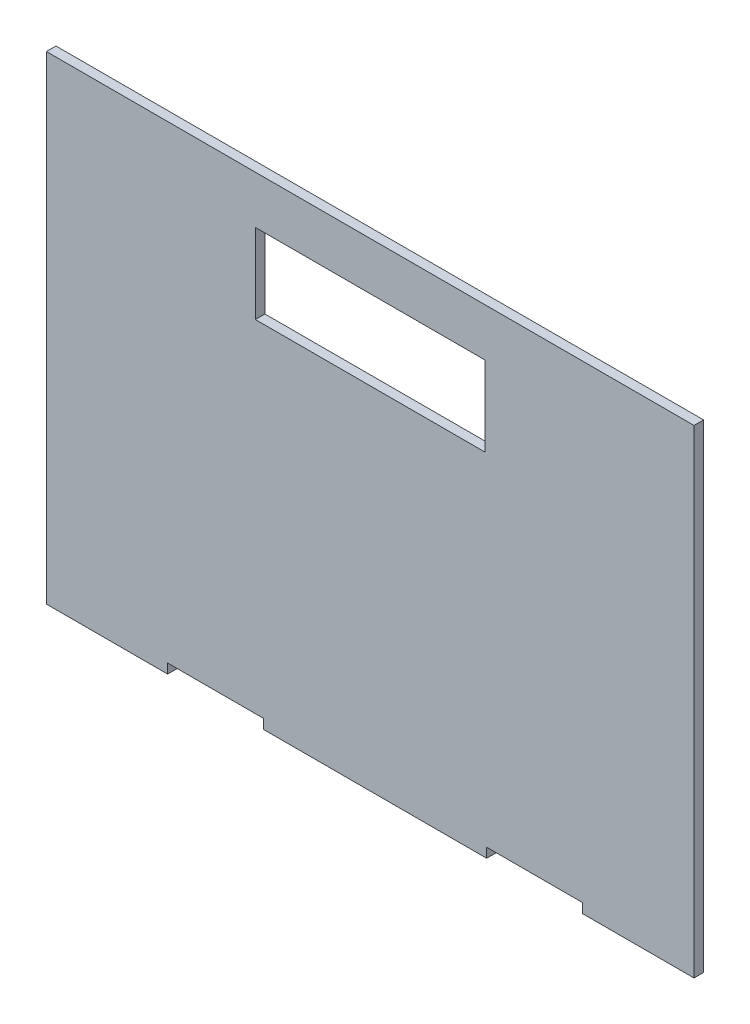
ISO-10303-21;
HEADER;
FILE_DESCRIPTION(('STEP AP214'),'2;1');
FILE_NAME('part.step','',(''),(''),'','','');
FILE_SCHEMA(('AUTOMOTIVE_DESIGN { 1 0 10303 214 1 1 1 1 }'));
ENDSEC;
DATA;
#1=APPLICATION_CONTEXT('core data for automotive mechanical design processes');
#2=APPLICATION_PROTOCOL_DEFINITION('international standard','automotive_design',2000,#1);
#3=PRODUCT_CONTEXT('',#1,'mechanical');
#4=PRODUCT('Part','Part','',(#3));
#5=PRODUCT_RELATED_PRODUCT_CATEGORY('part','',(#4));
#6=PRODUCT_DEFINITION_FORMATION('','',#4);
#7=PRODUCT_DEFINITION_CONTEXT('part definition',#1,'design');
#8=PRODUCT_DEFINITION('design','',#6,#7);
#9=PRODUCT_DEFINITION_SHAPE('','',#8);
#10=(LENGTH_UNIT() NAMED_UNIT(*) SI_UNIT(.MILLI.,.METRE.));
#11=(NAMED_UNIT(*) PLANE_ANGLE_UNIT() SI_UNIT($,.RADIAN.));
#12=(NAMED_UNIT(*) SI_UNIT($,.STERADIAN.) SOLID_ANGLE_UNIT());
#13=UNCERTAINTY_MEASURE_WITH_UNIT(LENGTH_MEASURE(1.E-05),#10,'distance_accuracy_value','');
#14=(GEOMETRIC_REPRESENTATION_CONTEXT(3) GLOBAL_UNCERTAINTY_ASSIGNED_CONTEXT((#13)) GLOBAL_UNIT_ASSIGNED_CONTEXT((#10,
#11,#12)) REPRESENTATION_CONTEXT('',''));
#15=CARTESIAN_POINT('',(0.,0.,0.));
#16=DIRECTION('',(0.,0.,1.));
#17=DIRECTION('',(1.,0.,0.));
#18=AXIS2_PLACEMENT_3D('',#15,#16,#17);
#19=CARTESIAN_POINT('',(-101.5,-75.,3.));
#20=DIRECTION('',(0.,1.,0.));
#21=DIRECTION('',(0.,0.,1.));
#22=AXIS2_PLACEMENT_3D('',#19,#20,#21);
#23=PLANE('',#22);
#24=DIRECTION('',(1.,0.,0.));
#25=VECTOR('',#24,1.);
#26=CARTESIAN_POINT('',(-101.5,-75.,0.));
#27=LINE('',#26,#25);
#28=CARTESIAN_POINT('',(-101.5,-75.,0.));
#29=VERTEX_POINT('',#28);
#30=CARTESIAN_POINT('',(-63.5,-75.,0.));
#31=VERTEX_POINT('',#30);
#32=EDGE_CURVE('E171',#29,#31,#27,.T.);
#33=ORIENTED_EDGE('',*,*,#32,.T.);
#34=DIRECTION('',(0.,0.,1.));
#35=VECTOR('',#34,1.);
#36=CARTESIAN_POINT('',(-63.5,-75.,-7.));
#37=LINE('',#36,#35);
#38=CARTESIAN_POINT('',(-63.5,-75.,3.));
#39=VERTEX_POINT('',#38);
#40=EDGE_CURVE('E154',#31,#39,#37,.T.);
#41=ORIENTED_EDGE('',*,*,#40,.T.);
#42=DIRECTION('',(1.,0.,0.));
#43=VECTOR('',#42,1.);
#44=CARTESIAN_POINT('',(-101.5,-75.,3.));
#45=LINE('',#44,#43);
#46=CARTESIAN_POINT('',(-101.5,-75.,3.));
#47=VERTEX_POINT('',#46);
#48=EDGE_CURVE('E169',#47,#39,#45,.T.);
#49=ORIENTED_EDGE('',*,*,#48,.F.);
#50=DIRECTION('',(0.,0.,-1.));
#51=VECTOR('',#50,1.);
#52=CARTESIAN_POINT('',(-101.5,-75.,3.));
#53=LINE('',#52,#51);
#54=EDGE_CURVE('E189',#47,#29,#53,.T.);
#55=ORIENTED_EDGE('',*,*,#54,.T.);
#56=EDGE_LOOP('',(#33,#41,#49,#55));
#57=FACE_BOUND('',#56,.T.);
#58=ADVANCED_FACE('F38',(#57),#23,.F.);
#59=CARTESIAN_POINT('',(-33.5,-75.,3.));
#60=VERTEX_POINT('',#59);
#61=CARTESIAN_POINT('',(36.5,-75.,3.));
#62=VERTEX_POINT('',#61);
#63=EDGE_CURVE('E183',#60,#62,#45,.T.);
#64=ORIENTED_EDGE('',*,*,#63,.F.);
#65=DIRECTION('',(0.,0.,1.));
#66=VECTOR('',#65,1.);
#67=CARTESIAN_POINT('',(-33.5,-75.,-7.));
#68=LINE('',#67,#66);
#69=CARTESIAN_POINT('',(-33.5,-75.,0.));
#70=VERTEX_POINT('',#69);
#71=EDGE_CURVE('E173',#70,#60,#68,.T.);
#72=ORIENTED_EDGE('',*,*,#71,.F.);
#73=CARTESIAN_POINT('',(36.5,-75.,0.));
#74=VERTEX_POINT('',#73);
#75=EDGE_CURVE('E281',#70,#74,#27,.T.);
#76=ORIENTED_EDGE('',*,*,#75,.T.);
#77=DIRECTION('',(0.,0.,1.));
#78=VECTOR('',#77,1.);
#79=CARTESIAN_POINT('',(36.5,-75.,-7.));
#80=LINE('',#79,#78);
#81=EDGE_CURVE('E163',#74,#62,#80,.T.);
#82=ORIENTED_EDGE('',*,*,#81,.T.);
#83=EDGE_LOOP('',(#64,#72,#76,#82));
#84=FACE_BOUND('',#83,.T.);
#85=ADVANCED_FACE('F353',(#84),#23,.F.);
#86=CARTESIAN_POINT('',(101.5,75.,3.));
#87=DIRECTION('',(-1.,0.,0.));
#88=DIRECTION('',(0.,-1.,0.));
#89=AXIS2_PLACEMENT_3D('',#86,#87,#88);
#90=PLANE('',#89);
#91=DIRECTION('',(0.,1.,0.));
#92=VECTOR('',#91,1.);
#93=CARTESIAN_POINT('',(101.5,75.,0.));
#94=LINE('',#93,#92);
#95=CARTESIAN_POINT('',(101.5,-75.,0.));
#96=VERTEX_POINT('',#95);
#97=CARTESIAN_POINT('',(101.5,75.,0.));
#98=VERTEX_POINT('',#97);
#99=EDGE_CURVE('E221',#96,#98,#94,.T.);
#100=ORIENTED_EDGE('',*,*,#99,.T.);
#101=DIRECTION('',(0.,0.,-1.));
#102=VECTOR('',#101,1.);
#103=CARTESIAN_POINT('',(101.5,75.,3.));
#104=LINE('',#103,#102);
#105=CARTESIAN_POINT('',(101.5,75.,3.));
#106=VERTEX_POINT('',#105);
#107=EDGE_CURVE('E312',#106,#98,#104,.T.);
#108=ORIENTED_EDGE('',*,*,#107,.F.);
#109=DIRECTION('',(0.,1.,0.));
#110=VECTOR('',#109,1.);
#111=CARTESIAN_POINT('',(101.5,75.,3.));
#112=LINE('',#111,#110);
#113=CARTESIAN_POINT('',(101.5,-75.,3.));
#114=VERTEX_POINT('',#113);
#115=EDGE_CURVE('E202',#114,#106,#112,.T.);
#116=ORIENTED_EDGE('',*,*,#115,.F.);
#117=DIRECTION('',(0.,0.,-1.));
#118=VECTOR('',#117,1.);
#119=CARTESIAN_POINT('',(101.5,-75.,3.));
#120=LINE('',#119,#118);
#121=EDGE_CURVE('E182',#114,#96,#120,.T.);
#122=ORIENTED_EDGE('',*,*,#121,.T.);
#123=EDGE_LOOP('',(#100,#108,#116,#122));
#124=FACE_BOUND('',#123,.T.);
#125=ADVANCED_FACE('F40',(#124),#90,.F.);
#126=CARTESIAN_POINT('',(-101.5,75.,3.));
#127=DIRECTION('',(0.,-1.,0.));
#128=DIRECTION('',(0.,0.,-1.));
#129=AXIS2_PLACEMENT_3D('',#126,#127,#128);
#130=PLANE('',#129);
#131=DIRECTION('',(-1.,0.,0.));
#132=VECTOR('',#131,1.);
#133=CARTESIAN_POINT('',(-101.5,75.,0.));
#134=LINE('',#133,#132);
#135=CARTESIAN_POINT('',(-101.5,75.,0.));
#136=VERTEX_POINT('',#135);
#137=EDGE_CURVE('E328',#98,#136,#134,.T.);
#138=ORIENTED_EDGE('',*,*,#137,.T.);
#139=DIRECTION('',(0.,0.,-1.));
#140=VECTOR('',#139,1.);
#141=CARTESIAN_POINT('',(-101.5,75.,3.));
#142=LINE('',#141,#140);
#143=CARTESIAN_POINT('',(-101.5,75.,3.));
#144=VERTEX_POINT('',#143);
#145=EDGE_CURVE('E316',#144,#136,#142,.T.);
#146=ORIENTED_EDGE('',*,*,#145,.F.);
#147=DIRECTION('',(-1.,0.,0.));
#148=VECTOR('',#147,1.);
#149=CARTESIAN_POINT('',(-101.5,75.,3.));
#150=LINE('',#149,#148);
#151=EDGE_CURVE('E200',#106,#144,#150,.T.);
#152=ORIENTED_EDGE('',*,*,#151,.F.);
#153=ORIENTED_EDGE('',*,*,#107,.T.);
#154=EDGE_LOOP('',(#138,#146,#152,#153));
#155=FACE_BOUND('',#154,.T.);
#156=ADVANCED_FACE('F340',(#155),#130,.F.);
#157=CARTESIAN_POINT('',(-101.5,75.,3.));
#158=DIRECTION('',(1.,0.,0.));
#159=DIRECTION('',(0.,1.,0.));
#160=AXIS2_PLACEMENT_3D('',#157,#158,#159);
#161=PLANE('',#160);
#162=DIRECTION('',(0.,-1.,0.));
#163=VECTOR('',#162,1.);
#164=CARTESIAN_POINT('',(-101.5,75.,0.));
#165=LINE('',#164,#163);
#166=EDGE_CURVE('E325',#136,#29,#165,.T.);
#167=ORIENTED_EDGE('',*,*,#166,.T.);
#168=ORIENTED_EDGE('',*,*,#54,.F.);
#169=DIRECTION('',(0.,-1.,0.));
#170=VECTOR('',#169,1.);
#171=CARTESIAN_POINT('',(-101.5,75.,3.));
#172=LINE('',#171,#170);
#173=EDGE_CURVE('E179',#144,#47,#172,.T.);
#174=ORIENTED_EDGE('',*,*,#173,.F.);
#175=ORIENTED_EDGE('',*,*,#145,.T.);
#176=EDGE_LOOP('',(#167,#168,#174,#175));
#177=FACE_BOUND('',#176,.T.);
#178=ADVANCED_FACE('F342',(#177),#161,.F.);
#179=CARTESIAN_POINT('',(66.5,-75.,3.));
#180=VERTEX_POINT('',#179);
#181=EDGE_CURVE('E185',#180,#114,#45,.T.);
#182=ORIENTED_EDGE('',*,*,#181,.F.);
#183=DIRECTION('',(0.,0.,1.));
#184=VECTOR('',#183,1.);
#185=CARTESIAN_POINT('',(66.5,-75.,-7.));
#186=LINE('',#185,#184);
#187=CARTESIAN_POINT('',(66.5,-75.,0.));
#188=VERTEX_POINT('',#187);
#189=EDGE_CURVE('E236',#188,#180,#186,.T.);
#190=ORIENTED_EDGE('',*,*,#189,.F.);
#191=EDGE_CURVE('E324',#188,#96,#27,.T.);
#192=ORIENTED_EDGE('',*,*,#191,.T.);
#193=ORIENTED_EDGE('',*,*,#121,.F.);
#194=EDGE_LOOP('',(#182,#190,#192,#193));
#195=FACE_BOUND('',#194,.T.);
#196=ADVANCED_FACE('F344',(#195),#23,.F.);
#197=CARTESIAN_POINT('',(0.,0.,3.));
#198=DIRECTION('',(0.,0.,1.));
#199=DIRECTION('',(1.,0.,0.));
#200=AXIS2_PLACEMENT_3D('',#197,#198,#199);
#201=PLANE('',#200);
#202=DIRECTION('',(0.,-1.,0.));
#203=VECTOR('',#202,1.);
#204=CARTESIAN_POINT('',(-63.5,-75.,3.));
#205=LINE('',#204,#203);
#206=CARTESIAN_POINT('',(-63.5,-72.,3.));
#207=VERTEX_POINT('',#206);
#208=EDGE_CURVE('E151',#207,#39,#205,.T.);
#209=ORIENTED_EDGE('',*,*,#208,.F.);
#210=DIRECTION('',(-1.,0.,0.));
#211=VECTOR('',#210,1.);
#212=CARTESIAN_POINT('',(-63.5,-72.,3.));
#213=LINE('',#212,#211);
#214=CARTESIAN_POINT('',(-33.5,-72.,3.));
#215=VERTEX_POINT('',#214);
#216=EDGE_CURVE('E174',#215,#207,#213,.T.);
#217=ORIENTED_EDGE('',*,*,#216,.F.);
#218=DIRECTION('',(0.,1.,0.));
#219=VECTOR('',#218,1.);
#220=CARTESIAN_POINT('',(-33.5,-75.,3.));
#221=LINE('',#220,#219);
#222=EDGE_CURVE('E162',#60,#215,#221,.T.);
#223=ORIENTED_EDGE('',*,*,#222,.F.);
#224=ORIENTED_EDGE('',*,*,#63,.T.);
#225=DIRECTION('',(0.,-1.,0.));
#226=VECTOR('',#225,1.);
#227=CARTESIAN_POINT('',(36.5,-75.,3.));
#228=LINE('',#227,#226);
#229=CARTESIAN_POINT('',(36.5,-72.,3.));
#230=VERTEX_POINT('',#229);
#231=EDGE_CURVE('E239',#230,#62,#228,.T.);
#232=ORIENTED_EDGE('',*,*,#231,.F.);
#233=DIRECTION('',(-1.,0.,0.));
#234=VECTOR('',#233,1.);
#235=CARTESIAN_POINT('',(36.5,-72.,3.));
#236=LINE('',#235,#234);
#237=CARTESIAN_POINT('',(66.5,-72.,3.));
#238=VERTEX_POINT('',#237);
#239=EDGE_CURVE('E250',#238,#230,#236,.T.);
#240=ORIENTED_EDGE('',*,*,#239,.F.);
#241=DIRECTION('',(0.,1.,0.));
#242=VECTOR('',#241,1.);
#243=CARTESIAN_POINT('',(66.5,-75.,3.));
#244=LINE('',#243,#242);
#245=EDGE_CURVE('E254',#180,#238,#244,.T.);
#246=ORIENTED_EDGE('',*,*,#245,.F.);
#247=ORIENTED_EDGE('',*,*,#181,.T.);
#248=ORIENTED_EDGE('',*,*,#115,.T.);
#249=ORIENTED_EDGE('',*,*,#151,.T.);
#250=ORIENTED_EDGE('',*,*,#173,.T.);
#251=ORIENTED_EDGE('',*,*,#48,.T.);
#252=EDGE_LOOP('',(#209,#217,#223,#224,#232,#240,#246,#247,#248,#249,#250,#251));
#253=FACE_BOUND('',#252,.T.);
#254=DIRECTION('',(0.,1.,0.));
#255=VECTOR('',#254,1.);
#256=CARTESIAN_POINT('',(36.,60.,3.));
#257=LINE('',#256,#255);
#258=CARTESIAN_POINT('',(36.,35.,3.));
#259=VERTEX_POINT('',#258);
#260=CARTESIAN_POINT('',(36.,60.,3.));
#261=VERTEX_POINT('',#260);
#262=EDGE_CURVE('E233',#259,#261,#257,.T.);
#263=ORIENTED_EDGE('',*,*,#262,.F.);
#264=DIRECTION('',(1.,0.,0.));
#265=VECTOR('',#264,1.);
#266=CARTESIAN_POINT('',(-36.,35.,3.));
#267=LINE('',#266,#265);
#268=CARTESIAN_POINT('',(-36.,35.,3.));
#269=VERTEX_POINT('',#268);
#270=EDGE_CURVE('E212',#269,#259,#267,.T.);
#271=ORIENTED_EDGE('',*,*,#270,.F.);
#272=DIRECTION('',(0.,-1.,0.));
#273=VECTOR('',#272,1.);
#274=CARTESIAN_POINT('',(-36.,60.,3.));
#275=LINE('',#274,#273);
#276=CARTESIAN_POINT('',(-36.,60.,3.));
#277=VERTEX_POINT('',#276);
#278=EDGE_CURVE('E225',#277,#269,#275,.T.);
#279=ORIENTED_EDGE('',*,*,#278,.F.);
#280=DIRECTION('',(-1.,0.,0.));
#281=VECTOR('',#280,1.);
#282=CARTESIAN_POINT('',(-36.,60.,3.));
#283=LINE('',#282,#281);
#284=EDGE_CURVE('E229',#261,#277,#283,.T.);
#285=ORIENTED_EDGE('',*,*,#284,.F.);
#286=EDGE_LOOP('',(#263,#271,#279,#285));
#287=FACE_BOUND('',#286,.T.);
#288=ADVANCED_FACE('F176',(#253,#287),#201,.T.);
#289=CARTESIAN_POINT('',(0.,0.,0.));
#290=DIRECTION('',(0.,0.,1.));
#291=DIRECTION('',(1.,0.,0.));
#292=AXIS2_PLACEMENT_3D('',#289,#290,#291);
#293=PLANE('',#292);
#294=DIRECTION('',(1.,0.,0.));
#295=VECTOR('',#294,1.);
#296=CARTESIAN_POINT('',(0.,35.,0.));
#297=LINE('',#296,#295);
#298=CARTESIAN_POINT('',(-36.,35.,0.));
#299=VERTEX_POINT('',#298);
#300=CARTESIAN_POINT('',(36.,35.,0.));
#301=VERTEX_POINT('',#300);
#302=EDGE_CURVE('E300',#299,#301,#297,.T.);
#303=ORIENTED_EDGE('',*,*,#302,.T.);
#304=DIRECTION('',(0.,1.,0.));
#305=VECTOR('',#304,1.);
#306=CARTESIAN_POINT('',(36.,0.,0.));
#307=LINE('',#306,#305);
#308=CARTESIAN_POINT('',(36.,60.,0.));
#309=VERTEX_POINT('',#308);
#310=EDGE_CURVE('E296',#301,#309,#307,.T.);
#311=ORIENTED_EDGE('',*,*,#310,.T.);
#312=DIRECTION('',(-1.,0.,0.));
#313=VECTOR('',#312,1.);
#314=CARTESIAN_POINT('',(0.,60.,0.));
#315=LINE('',#314,#313);
#316=CARTESIAN_POINT('',(-36.,60.,0.));
#317=VERTEX_POINT('',#316);
#318=EDGE_CURVE('E308',#309,#317,#315,.T.);
#319=ORIENTED_EDGE('',*,*,#318,.T.);
#320=DIRECTION('',(0.,-1.,0.));
#321=VECTOR('',#320,1.);
#322=CARTESIAN_POINT('',(-36.,0.,0.));
#323=LINE('',#322,#321);
#324=EDGE_CURVE('E304',#317,#299,#323,.T.);
#325=ORIENTED_EDGE('',*,*,#324,.T.);
#326=EDGE_LOOP('',(#303,#311,#319,#325));
#327=FACE_BOUND('',#326,.T.);
#328=DIRECTION('',(-1.,0.,0.));
#329=VECTOR('',#328,1.);
#330=CARTESIAN_POINT('',(0.,-72.,0.));
#331=LINE('',#330,#329);
#332=CARTESIAN_POINT('',(-33.5,-72.,0.));
#333=VERTEX_POINT('',#332);
#334=CARTESIAN_POINT('',(-63.5,-72.,0.));
#335=VERTEX_POINT('',#334);
#336=EDGE_CURVE('E47',#333,#335,#331,.T.);
#337=ORIENTED_EDGE('',*,*,#336,.T.);
#338=DIRECTION('',(0.,-1.,0.));
#339=VECTOR('',#338,1.);
#340=CARTESIAN_POINT('',(-63.5,0.,0.));
#341=LINE('',#340,#339);
#342=EDGE_CURVE('E11',#335,#31,#341,.T.);
#343=ORIENTED_EDGE('',*,*,#342,.T.);
#344=ORIENTED_EDGE('',*,*,#32,.F.);
#345=ORIENTED_EDGE('',*,*,#166,.F.);
#346=ORIENTED_EDGE('',*,*,#137,.F.);
#347=ORIENTED_EDGE('',*,*,#99,.F.);
#348=ORIENTED_EDGE('',*,*,#191,.F.);
#349=DIRECTION('',(0.,1.,0.));
#350=VECTOR('',#349,1.);
#351=CARTESIAN_POINT('',(66.4999999999996,3.07624296406552E-13,0.));
#352=LINE('',#351,#350);
#353=CARTESIAN_POINT('',(66.5,-72.,0.));
#354=VERTEX_POINT('',#353);
#355=EDGE_CURVE('E292',#188,#354,#352,.T.);
#356=ORIENTED_EDGE('',*,*,#355,.T.);
#357=DIRECTION('',(-1.,0.,0.));
#358=VECTOR('',#357,1.);
#359=CARTESIAN_POINT('',(0.,-72.,0.));
#360=LINE('',#359,#358);
#361=CARTESIAN_POINT('',(36.5,-72.,0.));
#362=VERTEX_POINT('',#361);
#363=EDGE_CURVE('E286',#354,#362,#360,.T.);
#364=ORIENTED_EDGE('',*,*,#363,.T.);
#365=DIRECTION('',(0.,-1.,0.));
#366=VECTOR('',#365,1.);
#367=CARTESIAN_POINT('',(36.5,0.,0.));
#368=LINE('',#367,#366);
#369=EDGE_CURVE('E283',#362,#74,#368,.T.);
#370=ORIENTED_EDGE('',*,*,#369,.T.);
#371=ORIENTED_EDGE('',*,*,#75,.F.);
#372=DIRECTION('',(0.,1.,0.));
#373=VECTOR('',#372,1.);
#374=CARTESIAN_POINT('',(-33.5000000000004,-1.54968630520596E-13,0.));
#375=LINE('',#374,#373);
#376=EDGE_CURVE('E276',#70,#333,#375,.T.);
#377=ORIENTED_EDGE('',*,*,#376,.T.);
#378=EDGE_LOOP('',(#337,#343,#344,#345,#346,#347,#348,#356,#364,#370,#371,#377));
#379=FACE_BOUND('',#378,.T.);
#380=ADVANCED_FACE('F278',(#327,#379),#293,.F.);
#381=CARTESIAN_POINT('',(36.,60.,-7.));
#382=DIRECTION('',(1.,0.,0.));
#383=DIRECTION('',(0.,1.,0.));
#384=AXIS2_PLACEMENT_3D('',#381,#382,#383);
#385=PLANE('',#384);
#386=DIRECTION('',(0.,0.,1.));
#387=VECTOR('',#386,1.);
#388=CARTESIAN_POINT('',(36.,35.,-7.));
#389=LINE('',#388,#387);
#390=EDGE_CURVE('E218',#301,#259,#389,.T.);
#391=ORIENTED_EDGE('',*,*,#390,.T.);
#392=ORIENTED_EDGE('',*,*,#262,.T.);
#393=DIRECTION('',(0.,0.,1.));
#394=VECTOR('',#393,1.);
#395=CARTESIAN_POINT('',(36.,60.,-7.));
#396=LINE('',#395,#394);
#397=EDGE_CURVE('E207',#309,#261,#396,.T.);
#398=ORIENTED_EDGE('',*,*,#397,.F.);
#399=ORIENTED_EDGE('',*,*,#310,.F.);
#400=EDGE_LOOP('',(#391,#392,#398,#399));
#401=FACE_BOUND('',#400,.T.);
#402=ADVANCED_FACE('F363',(#401),#385,.F.);
#403=CARTESIAN_POINT('',(-36.,35.,-7.));
#404=DIRECTION('',(0.,-1.,0.));
#405=DIRECTION('',(0.,0.,-1.));
#406=AXIS2_PLACEMENT_3D('',#403,#404,#405);
#407=PLANE('',#406);
#408=DIRECTION('',(0.,0.,1.));
#409=VECTOR('',#408,1.);
#410=CARTESIAN_POINT('',(-36.,35.,-7.));
#411=LINE('',#410,#409);
#412=EDGE_CURVE('E215',#299,#269,#411,.T.);
#413=ORIENTED_EDGE('',*,*,#412,.T.);
#414=ORIENTED_EDGE('',*,*,#270,.T.);
#415=ORIENTED_EDGE('',*,*,#390,.F.);
#416=ORIENTED_EDGE('',*,*,#302,.F.);
#417=EDGE_LOOP('',(#413,#414,#415,#416));
#418=FACE_BOUND('',#417,.T.);
#419=ADVANCED_FACE('F369',(#418),#407,.F.);
#420=CARTESIAN_POINT('',(-36.,60.,-7.));
#421=DIRECTION('',(-1.,0.,0.));
#422=DIRECTION('',(0.,0.,1.));
#423=AXIS2_PLACEMENT_3D('',#420,#421,#422);
#424=PLANE('',#423);
#425=DIRECTION('',(0.,0.,1.));
#426=VECTOR('',#425,1.);
#427=CARTESIAN_POINT('',(-36.,60.,-7.));
#428=LINE('',#427,#426);
#429=EDGE_CURVE('E211',#317,#277,#428,.T.);
#430=ORIENTED_EDGE('',*,*,#429,.T.);
#431=ORIENTED_EDGE('',*,*,#278,.T.);
#432=ORIENTED_EDGE('',*,*,#412,.F.);
#433=ORIENTED_EDGE('',*,*,#324,.F.);
#434=EDGE_LOOP('',(#430,#431,#432,#433));
#435=FACE_BOUND('',#434,.T.);
#436=ADVANCED_FACE('F375',(#435),#424,.F.);
#437=CARTESIAN_POINT('',(-36.,60.,-7.));
#438=DIRECTION('',(0.,1.,0.));
#439=DIRECTION('',(0.,0.,1.));
#440=AXIS2_PLACEMENT_3D('',#437,#438,#439);
#441=PLANE('',#440);
#442=ORIENTED_EDGE('',*,*,#397,.T.);
#443=ORIENTED_EDGE('',*,*,#284,.T.);
#444=ORIENTED_EDGE('',*,*,#429,.F.);
#445=ORIENTED_EDGE('',*,*,#318,.F.);
#446=EDGE_LOOP('',(#442,#443,#444,#445));
#447=FACE_BOUND('',#446,.T.);
#448=ADVANCED_FACE('F371',(#447),#441,.F.);
#449=CARTESIAN_POINT('',(36.5,-75.,-7.));
#450=DIRECTION('',(-1.,0.,0.));
#451=DIRECTION('',(0.,0.,1.));
#452=AXIS2_PLACEMENT_3D('',#449,#450,#451);
#453=PLANE('',#452);
#454=DIRECTION('',(0.,0.,1.));
#455=VECTOR('',#454,1.);
#456=CARTESIAN_POINT('',(36.5,-72.,-7.));
#457=LINE('',#456,#455);
#458=EDGE_CURVE('E242',#362,#230,#457,.T.);
#459=ORIENTED_EDGE('',*,*,#458,.T.);
#460=ORIENTED_EDGE('',*,*,#231,.T.);
#461=ORIENTED_EDGE('',*,*,#81,.F.);
#462=ORIENTED_EDGE('',*,*,#369,.F.);
#463=EDGE_LOOP('',(#459,#460,#461,#462));
#464=FACE_BOUND('',#463,.T.);
#465=ADVANCED_FACE('F374',(#464),#453,.F.);
#466=CARTESIAN_POINT('',(36.5,-72.,-7.));
#467=DIRECTION('',(0.,1.,0.));
#468=DIRECTION('',(0.,0.,1.));
#469=AXIS2_PLACEMENT_3D('',#466,#467,#468);
#470=PLANE('',#469);
#471=DIRECTION('',(0.,0.,1.));
#472=VECTOR('',#471,1.);
#473=CARTESIAN_POINT('',(66.5,-72.,-7.));
#474=LINE('',#473,#472);
#475=EDGE_CURVE('E62',#354,#238,#474,.T.);
#476=ORIENTED_EDGE('',*,*,#475,.T.);
#477=ORIENTED_EDGE('',*,*,#239,.T.);
#478=ORIENTED_EDGE('',*,*,#458,.F.);
#479=ORIENTED_EDGE('',*,*,#363,.F.);
#480=EDGE_LOOP('',(#476,#477,#478,#479));
#481=FACE_BOUND('',#480,.T.);
#482=ADVANCED_FACE('F386',(#481),#470,.F.);
#483=CARTESIAN_POINT('',(66.5,-75.,-7.));
#484=DIRECTION('',(1.,0.,0.));
#485=DIRECTION('',(0.,1.,0.));
#486=AXIS2_PLACEMENT_3D('',#483,#484,#485);
#487=PLANE('',#486);
#488=ORIENTED_EDGE('',*,*,#189,.T.);
#489=ORIENTED_EDGE('',*,*,#245,.T.);
#490=ORIENTED_EDGE('',*,*,#475,.F.);
#491=ORIENTED_EDGE('',*,*,#355,.F.);
#492=EDGE_LOOP('',(#488,#489,#490,#491));
#493=FACE_BOUND('',#492,.T.);
#494=ADVANCED_FACE('F383',(#493),#487,.F.);
#495=CARTESIAN_POINT('',(-63.5,-75.,-7.));
#496=DIRECTION('',(-1.,0.,0.));
#497=DIRECTION('',(0.,0.,1.));
#498=AXIS2_PLACEMENT_3D('',#495,#496,#497);
#499=PLANE('',#498);
#500=DIRECTION('',(0.,0.,1.));
#501=VECTOR('',#500,1.);
#502=CARTESIAN_POINT('',(-63.5,-72.,-7.));
#503=LINE('',#502,#501);
#504=EDGE_CURVE('E156',#335,#207,#503,.T.);
#505=ORIENTED_EDGE('',*,*,#504,.T.);
#506=ORIENTED_EDGE('',*,*,#208,.T.);
#507=ORIENTED_EDGE('',*,*,#40,.F.);
#508=ORIENTED_EDGE('',*,*,#342,.F.);
#509=EDGE_LOOP('',(#505,#506,#507,#508));
#510=FACE_BOUND('',#509,.T.);
#511=ADVANCED_FACE('F153',(#510),#499,.F.);
#512=CARTESIAN_POINT('',(-63.5,-72.,-7.));
#513=DIRECTION('',(0.,1.,0.));
#514=DIRECTION('',(0.,0.,1.));
#515=AXIS2_PLACEMENT_3D('',#512,#513,#514);
#516=PLANE('',#515);
#517=DIRECTION('',(0.,0.,1.));
#518=VECTOR('',#517,1.);
#519=CARTESIAN_POINT('',(-33.5,-72.,-7.));
#520=LINE('',#519,#518);
#521=EDGE_CURVE('E54',#333,#215,#520,.T.);
#522=ORIENTED_EDGE('',*,*,#521,.T.);
#523=ORIENTED_EDGE('',*,*,#216,.T.);
#524=ORIENTED_EDGE('',*,*,#504,.F.);
#525=ORIENTED_EDGE('',*,*,#336,.F.);
#526=EDGE_LOOP('',(#522,#523,#524,#525));
#527=FACE_BOUND('',#526,.T.);
#528=ADVANCED_FACE('F271',(#527),#516,.F.);
#529=CARTESIAN_POINT('',(-33.5,-75.,-7.));
#530=DIRECTION('',(1.,0.,0.));
#531=DIRECTION('',(0.,1.,0.));
#532=AXIS2_PLACEMENT_3D('',#529,#530,#531);
#533=PLANE('',#532);
#534=ORIENTED_EDGE('',*,*,#71,.T.);
#535=ORIENTED_EDGE('',*,*,#222,.T.);
#536=ORIENTED_EDGE('',*,*,#521,.F.);
#537=ORIENTED_EDGE('',*,*,#376,.F.);
#538=EDGE_LOOP('',(#534,#535,#536,#537));
#539=FACE_BOUND('',#538,.T.);
#540=ADVANCED_FACE('F267',(#539),#533,.F.);
#541=CLOSED_SHELL('',(#58,#85,#125,#156,#178,#196,#288,#380,#402,#419,#436,#448,#465,#482,#494,
#511,#528,#540));
#542=MANIFOLD_SOLID_BREP('B2',#541);
#543=ADVANCED_BREP_SHAPE_REPRESENTATION('',(#18,#542),#14);
#544=SHAPE_DEFINITION_REPRESENTATION(#9,#543);
ENDSEC;
END-ISO-10303-21;
